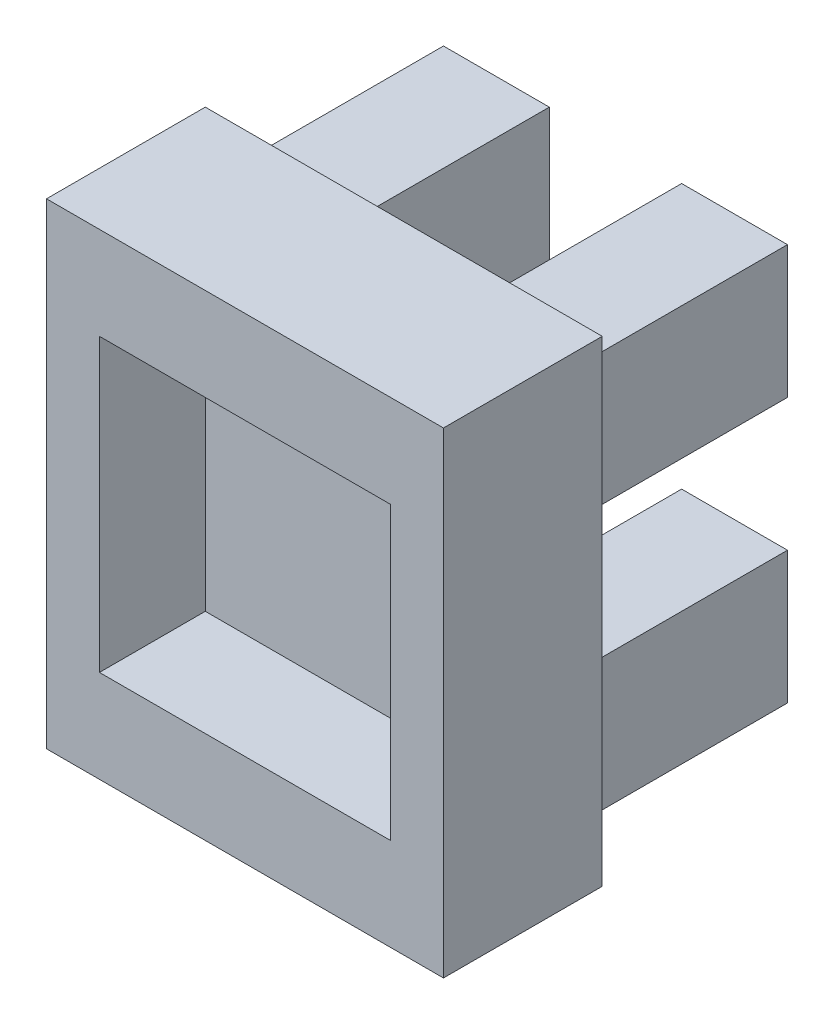
ISO-10303-21;
HEADER;
FILE_DESCRIPTION(('STEP AP214'),'2;1');
FILE_NAME('part.step','',(''),(''),'','','');
FILE_SCHEMA(('AUTOMOTIVE_DESIGN { 1 0 10303 214 1 1 1 1 }'));
ENDSEC;
DATA;
#1=APPLICATION_CONTEXT('core data for automotive mechanical design processes');
#2=APPLICATION_PROTOCOL_DEFINITION('international standard','automotive_design',2000,#1);
#3=PRODUCT_CONTEXT('',#1,'mechanical');
#4=PRODUCT('Part','Part','',(#3));
#5=PRODUCT_RELATED_PRODUCT_CATEGORY('part','',(#4));
#6=PRODUCT_DEFINITION_FORMATION('','',#4);
#7=PRODUCT_DEFINITION_CONTEXT('part definition',#1,'design');
#8=PRODUCT_DEFINITION('design','',#6,#7);
#9=PRODUCT_DEFINITION_SHAPE('','',#8);
#10=(LENGTH_UNIT() NAMED_UNIT(*) SI_UNIT(.MILLI.,.METRE.));
#11=(NAMED_UNIT(*) PLANE_ANGLE_UNIT() SI_UNIT($,.RADIAN.));
#12=(NAMED_UNIT(*) SI_UNIT($,.STERADIAN.) SOLID_ANGLE_UNIT());
#13=UNCERTAINTY_MEASURE_WITH_UNIT(LENGTH_MEASURE(1.E-05),#10,'distance_accuracy_value','');
#14=(GEOMETRIC_REPRESENTATION_CONTEXT(3) GLOBAL_UNCERTAINTY_ASSIGNED_CONTEXT((#13)) GLOBAL_UNIT_ASSIGNED_CONTEXT((#10,
#11,#12)) REPRESENTATION_CONTEXT('',''));
#15=CARTESIAN_POINT('',(0.,0.,0.));
#16=DIRECTION('',(0.,0.,1.));
#17=DIRECTION('',(1.,0.,0.));
#18=AXIS2_PLACEMENT_3D('',#15,#16,#17);
#19=CARTESIAN_POINT('',(7.5,-9.,3.));
#20=DIRECTION('',(-1.,0.,0.));
#21=DIRECTION('',(0.,0.,1.));
#22=AXIS2_PLACEMENT_3D('',#19,#20,#21);
#23=PLANE('',#22);
#24=DIRECTION('',(0.,1.,0.));
#25=VECTOR('',#24,1.);
#26=CARTESIAN_POINT('',(7.5,-9.,-3.));
#27=LINE('',#26,#25);
#28=CARTESIAN_POINT('',(7.5,-9.,-3.));
#29=VERTEX_POINT('',#28);
#30=CARTESIAN_POINT('',(7.5,9.,-3.));
#31=VERTEX_POINT('',#30);
#32=EDGE_CURVE('E361',#29,#31,#27,.T.);
#33=ORIENTED_EDGE('',*,*,#32,.T.);
#34=DIRECTION('',(0.,0.,-1.));
#35=VECTOR('',#34,1.);
#36=CARTESIAN_POINT('',(7.5,9.,3.));
#37=LINE('',#36,#35);
#38=CARTESIAN_POINT('',(7.5,9.,3.));
#39=VERTEX_POINT('',#38);
#40=EDGE_CURVE('E11',#39,#31,#37,.T.);
#41=ORIENTED_EDGE('',*,*,#40,.F.);
#42=DIRECTION('',(0.,1.,0.));
#43=VECTOR('',#42,1.);
#44=CARTESIAN_POINT('',(7.5,-9.,3.));
#45=LINE('',#44,#43);
#46=CARTESIAN_POINT('',(7.5,-9.,3.));
#47=VERTEX_POINT('',#46);
#48=EDGE_CURVE('E367',#47,#39,#45,.T.);
#49=ORIENTED_EDGE('',*,*,#48,.F.);
#50=DIRECTION('',(0.,0.,-1.));
#51=VECTOR('',#50,1.);
#52=CARTESIAN_POINT('',(7.5,-9.,3.));
#53=LINE('',#52,#51);
#54=EDGE_CURVE('E379',#47,#29,#53,.T.);
#55=ORIENTED_EDGE('',*,*,#54,.T.);
#56=EDGE_LOOP('',(#33,#41,#49,#55));
#57=FACE_BOUND('',#56,.T.);
#58=ADVANCED_FACE('F43',(#57),#23,.F.);
#59=CARTESIAN_POINT('',(-7.5,9.,3.));
#60=DIRECTION('',(0.,-1.,0.));
#61=DIRECTION('',(0.,0.,-1.));
#62=AXIS2_PLACEMENT_3D('',#59,#60,#61);
#63=PLANE('',#62);
#64=DIRECTION('',(-1.,0.,0.));
#65=VECTOR('',#64,1.);
#66=CARTESIAN_POINT('',(-7.5,9.,-3.));
#67=LINE('',#66,#65);
#68=CARTESIAN_POINT('',(-7.5,9.,-3.));
#69=VERTEX_POINT('',#68);
#70=EDGE_CURVE('E382',#31,#69,#67,.T.);
#71=ORIENTED_EDGE('',*,*,#70,.T.);
#72=DIRECTION('',(0.,0.,-1.));
#73=VECTOR('',#72,1.);
#74=CARTESIAN_POINT('',(-7.5,9.,3.));
#75=LINE('',#74,#73);
#76=CARTESIAN_POINT('',(-7.5,9.,3.));
#77=VERTEX_POINT('',#76);
#78=EDGE_CURVE('E49',#77,#69,#75,.T.);
#79=ORIENTED_EDGE('',*,*,#78,.F.);
#80=DIRECTION('',(-1.,0.,0.));
#81=VECTOR('',#80,1.);
#82=CARTESIAN_POINT('',(-7.5,9.,3.));
#83=LINE('',#82,#81);
#84=EDGE_CURVE('E373',#39,#77,#83,.T.);
#85=ORIENTED_EDGE('',*,*,#84,.F.);
#86=ORIENTED_EDGE('',*,*,#40,.T.);
#87=EDGE_LOOP('',(#71,#79,#85,#86));
#88=FACE_BOUND('',#87,.T.);
#89=ADVANCED_FACE('F411',(#88),#63,.F.);
#90=CARTESIAN_POINT('',(-7.5,-9.,3.));
#91=DIRECTION('',(1.,0.,0.));
#92=DIRECTION('',(0.,0.,-1.));
#93=AXIS2_PLACEMENT_3D('',#90,#91,#92);
#94=PLANE('',#93);
#95=DIRECTION('',(0.,-1.,0.));
#96=VECTOR('',#95,1.);
#97=CARTESIAN_POINT('',(-7.5,-9.,-3.));
#98=LINE('',#97,#96);
#99=CARTESIAN_POINT('',(-7.5,-9.,-3.));
#100=VERTEX_POINT('',#99);
#101=EDGE_CURVE('E384',#69,#100,#98,.T.);
#102=ORIENTED_EDGE('',*,*,#101,.T.);
#103=DIRECTION('',(0.,0.,-1.));
#104=VECTOR('',#103,1.);
#105=CARTESIAN_POINT('',(-7.5,-9.,3.));
#106=LINE('',#105,#104);
#107=CARTESIAN_POINT('',(-7.5,-9.,3.));
#108=VERTEX_POINT('',#107);
#109=EDGE_CURVE('E388',#108,#100,#106,.T.);
#110=ORIENTED_EDGE('',*,*,#109,.F.);
#111=DIRECTION('',(0.,-1.,0.));
#112=VECTOR('',#111,1.);
#113=CARTESIAN_POINT('',(-7.5,-9.,3.));
#114=LINE('',#113,#112);
#115=EDGE_CURVE('E376',#77,#108,#114,.T.);
#116=ORIENTED_EDGE('',*,*,#115,.F.);
#117=ORIENTED_EDGE('',*,*,#78,.T.);
#118=EDGE_LOOP('',(#102,#110,#116,#117));
#119=FACE_BOUND('',#118,.T.);
#120=ADVANCED_FACE('F396',(#119),#94,.F.);
#121=CARTESIAN_POINT('',(-7.5,-9.,3.));
#122=DIRECTION('',(0.,1.,0.));
#123=DIRECTION('',(-1.,0.,0.));
#124=AXIS2_PLACEMENT_3D('',#121,#122,#123);
#125=PLANE('',#124);
#126=DIRECTION('',(1.,0.,0.));
#127=VECTOR('',#126,1.);
#128=CARTESIAN_POINT('',(-7.5,-9.,-3.));
#129=LINE('',#128,#127);
#130=EDGE_CURVE('E372',#100,#29,#129,.T.);
#131=ORIENTED_EDGE('',*,*,#130,.T.);
#132=ORIENTED_EDGE('',*,*,#54,.F.);
#133=DIRECTION('',(1.,0.,0.));
#134=VECTOR('',#133,1.);
#135=CARTESIAN_POINT('',(-7.5,-9.,3.));
#136=LINE('',#135,#134);
#137=EDGE_CURVE('E378',#108,#47,#136,.T.);
#138=ORIENTED_EDGE('',*,*,#137,.F.);
#139=ORIENTED_EDGE('',*,*,#109,.T.);
#140=EDGE_LOOP('',(#131,#132,#138,#139));
#141=FACE_BOUND('',#140,.T.);
#142=ADVANCED_FACE('F403',(#141),#125,.F.);
#143=CARTESIAN_POINT('',(0.,0.,3.));
#144=DIRECTION('',(0.,0.,-1.));
#145=DIRECTION('',(-1.,0.,0.));
#146=AXIS2_PLACEMENT_3D('',#143,#144,#145);
#147=PLANE('',#146);
#148=DIRECTION('',(-1.,0.,0.));
#149=VECTOR('',#148,1.);
#150=CARTESIAN_POINT('',(-5.5,5.5,3.));
#151=LINE('',#150,#149);
#152=CARTESIAN_POINT('',(5.5,5.5,3.));
#153=VERTEX_POINT('',#152);
#154=CARTESIAN_POINT('',(-5.5,5.5,3.));
#155=VERTEX_POINT('',#154);
#156=EDGE_CURVE('E354',#153,#155,#151,.T.);
#157=ORIENTED_EDGE('',*,*,#156,.F.);
#158=DIRECTION('',(0.,1.,0.));
#159=VECTOR('',#158,1.);
#160=CARTESIAN_POINT('',(5.5,-5.5,3.));
#161=LINE('',#160,#159);
#162=CARTESIAN_POINT('',(5.5,-5.5,3.));
#163=VERTEX_POINT('',#162);
#164=EDGE_CURVE('E340',#163,#153,#161,.T.);
#165=ORIENTED_EDGE('',*,*,#164,.F.);
#166=DIRECTION('',(1.,0.,0.));
#167=VECTOR('',#166,1.);
#168=CARTESIAN_POINT('',(-5.5,-5.5,3.));
#169=LINE('',#168,#167);
#170=CARTESIAN_POINT('',(-5.5,-5.5,3.));
#171=VERTEX_POINT('',#170);
#172=EDGE_CURVE('E341',#171,#163,#169,.T.);
#173=ORIENTED_EDGE('',*,*,#172,.F.);
#174=DIRECTION('',(0.,-1.,0.));
#175=VECTOR('',#174,1.);
#176=CARTESIAN_POINT('',(-5.5,-5.5,3.));
#177=LINE('',#176,#175);
#178=EDGE_CURVE('E359',#155,#171,#177,.T.);
#179=ORIENTED_EDGE('',*,*,#178,.F.);
#180=EDGE_LOOP('',(#157,#165,#173,#179));
#181=FACE_BOUND('',#180,.T.);
#182=ORIENTED_EDGE('',*,*,#48,.T.);
#183=ORIENTED_EDGE('',*,*,#84,.T.);
#184=ORIENTED_EDGE('',*,*,#115,.T.);
#185=ORIENTED_EDGE('',*,*,#137,.T.);
#186=EDGE_LOOP('',(#182,#183,#184,#185));
#187=FACE_BOUND('',#186,.T.);
#188=ADVANCED_FACE('F414',(#181,#187),#147,.F.);
#189=CARTESIAN_POINT('',(0.,0.,-3.));
#190=DIRECTION('',(0.,0.,-1.));
#191=DIRECTION('',(-1.,0.,0.));
#192=AXIS2_PLACEMENT_3D('',#189,#190,#191);
#193=PLANE('',#192);
#194=DIRECTION('',(-1.,0.,0.));
#195=VECTOR('',#194,1.);
#196=CARTESIAN_POINT('',(6.5,-7.5,-3.));
#197=LINE('',#196,#195);
#198=CARTESIAN_POINT('',(6.5,-7.5,-3.));
#199=VERTEX_POINT('',#198);
#200=CARTESIAN_POINT('',(2.5,-7.5,-3.));
#201=VERTEX_POINT('',#200);
#202=EDGE_CURVE('E60',#199,#201,#197,.T.);
#203=ORIENTED_EDGE('',*,*,#202,.F.);
#204=DIRECTION('',(0.,-1.,0.));
#205=VECTOR('',#204,1.);
#206=CARTESIAN_POINT('',(6.5,-7.5,-3.));
#207=LINE('',#206,#205);
#208=CARTESIAN_POINT('',(6.5,-2.5,-3.));
#209=VERTEX_POINT('',#208);
#210=EDGE_CURVE('E62',#209,#199,#207,.T.);
#211=ORIENTED_EDGE('',*,*,#210,.F.);
#212=DIRECTION('',(1.,0.,0.));
#213=VECTOR('',#212,1.);
#214=CARTESIAN_POINT('',(6.5,-2.5,-3.));
#215=LINE('',#214,#213);
#216=CARTESIAN_POINT('',(2.5,-2.5,-3.));
#217=VERTEX_POINT('',#216);
#218=EDGE_CURVE('E292',#217,#209,#215,.T.);
#219=ORIENTED_EDGE('',*,*,#218,.F.);
#220=DIRECTION('',(0.,1.,0.));
#221=VECTOR('',#220,1.);
#222=CARTESIAN_POINT('',(2.5,-7.5,-3.));
#223=LINE('',#222,#221);
#224=EDGE_CURVE('E294',#201,#217,#223,.T.);
#225=ORIENTED_EDGE('',*,*,#224,.F.);
#226=EDGE_LOOP('',(#203,#211,#219,#225));
#227=FACE_BOUND('',#226,.T.);
#228=DIRECTION('',(0.,1.,0.));
#229=VECTOR('',#228,1.);
#230=CARTESIAN_POINT('',(-6.5,-7.5,-3.));
#231=LINE('',#230,#229);
#232=CARTESIAN_POINT('',(-6.5,-7.5,-3.));
#233=VERTEX_POINT('',#232);
#234=CARTESIAN_POINT('',(-6.5,-2.5,-3.));
#235=VERTEX_POINT('',#234);
#236=EDGE_CURVE('E226',#233,#235,#231,.T.);
#237=ORIENTED_EDGE('',*,*,#236,.F.);
#238=DIRECTION('',(-1.,0.,0.));
#239=VECTOR('',#238,1.);
#240=CARTESIAN_POINT('',(-6.5,-7.5,-3.));
#241=LINE('',#240,#239);
#242=CARTESIAN_POINT('',(-2.5,-7.5,-3.));
#243=VERTEX_POINT('',#242);
#244=EDGE_CURVE('E256',#243,#233,#241,.T.);
#245=ORIENTED_EDGE('',*,*,#244,.F.);
#246=DIRECTION('',(0.,-1.,0.));
#247=VECTOR('',#246,1.);
#248=CARTESIAN_POINT('',(-2.5,-7.5,-3.));
#249=LINE('',#248,#247);
#250=CARTESIAN_POINT('',(-2.5,-2.5,-3.));
#251=VERTEX_POINT('',#250);
#252=EDGE_CURVE('E261',#251,#243,#249,.T.);
#253=ORIENTED_EDGE('',*,*,#252,.F.);
#254=DIRECTION('',(1.,0.,0.));
#255=VECTOR('',#254,1.);
#256=CARTESIAN_POINT('',(-6.5,-2.5,-3.));
#257=LINE('',#256,#255);
#258=EDGE_CURVE('E264',#235,#251,#257,.T.);
#259=ORIENTED_EDGE('',*,*,#258,.F.);
#260=EDGE_LOOP('',(#237,#245,#253,#259));
#261=FACE_BOUND('',#260,.T.);
#262=DIRECTION('',(1.,0.,0.));
#263=VECTOR('',#262,1.);
#264=CARTESIAN_POINT('',(-6.5,7.5,-3.));
#265=LINE('',#264,#263);
#266=CARTESIAN_POINT('',(-6.5,7.5,-3.));
#267=VERTEX_POINT('',#266);
#268=CARTESIAN_POINT('',(-2.5,7.5,-3.));
#269=VERTEX_POINT('',#268);
#270=EDGE_CURVE('E222',#267,#269,#265,.T.);
#271=ORIENTED_EDGE('',*,*,#270,.F.);
#272=DIRECTION('',(0.,1.,0.));
#273=VECTOR('',#272,1.);
#274=CARTESIAN_POINT('',(-6.5,7.5,-3.));
#275=LINE('',#274,#273);
#276=CARTESIAN_POINT('',(-6.5,2.5,-3.));
#277=VERTEX_POINT('',#276);
#278=EDGE_CURVE('E210',#277,#267,#275,.T.);
#279=ORIENTED_EDGE('',*,*,#278,.F.);
#280=DIRECTION('',(-1.,0.,0.));
#281=VECTOR('',#280,1.);
#282=CARTESIAN_POINT('',(-6.5,2.5,-3.));
#283=LINE('',#282,#281);
#284=CARTESIAN_POINT('',(-2.5,2.5,-3.));
#285=VERTEX_POINT('',#284);
#286=EDGE_CURVE('E199',#285,#277,#283,.T.);
#287=ORIENTED_EDGE('',*,*,#286,.F.);
#288=DIRECTION('',(0.,-1.,0.));
#289=VECTOR('',#288,1.);
#290=CARTESIAN_POINT('',(-2.5,7.5,-3.));
#291=LINE('',#290,#289);
#292=EDGE_CURVE('E204',#269,#285,#291,.T.);
#293=ORIENTED_EDGE('',*,*,#292,.F.);
#294=EDGE_LOOP('',(#271,#279,#287,#293));
#295=FACE_BOUND('',#294,.T.);
#296=DIRECTION('',(0.,-1.,0.));
#297=VECTOR('',#296,1.);
#298=CARTESIAN_POINT('',(6.5,7.5,-3.));
#299=LINE('',#298,#297);
#300=CARTESIAN_POINT('',(6.5,7.5,-3.));
#301=VERTEX_POINT('',#300);
#302=CARTESIAN_POINT('',(6.5,2.5,-3.));
#303=VERTEX_POINT('',#302);
#304=EDGE_CURVE('E236',#301,#303,#299,.T.);
#305=ORIENTED_EDGE('',*,*,#304,.F.);
#306=DIRECTION('',(1.,0.,0.));
#307=VECTOR('',#306,1.);
#308=CARTESIAN_POINT('',(6.5,7.5,-3.));
#309=LINE('',#308,#307);
#310=CARTESIAN_POINT('',(2.5,7.5,-3.));
#311=VERTEX_POINT('',#310);
#312=EDGE_CURVE('E310',#311,#301,#309,.T.);
#313=ORIENTED_EDGE('',*,*,#312,.F.);
#314=DIRECTION('',(0.,1.,0.));
#315=VECTOR('',#314,1.);
#316=CARTESIAN_POINT('',(2.5,7.5,-3.));
#317=LINE('',#316,#315);
#318=CARTESIAN_POINT('',(2.5,2.5,-3.));
#319=VERTEX_POINT('',#318);
#320=EDGE_CURVE('E321',#319,#311,#317,.T.);
#321=ORIENTED_EDGE('',*,*,#320,.F.);
#322=DIRECTION('',(-1.,0.,0.));
#323=VECTOR('',#322,1.);
#324=CARTESIAN_POINT('',(6.5,2.5,-3.));
#325=LINE('',#324,#323);
#326=EDGE_CURVE('E318',#303,#319,#325,.T.);
#327=ORIENTED_EDGE('',*,*,#326,.F.);
#328=EDGE_LOOP('',(#305,#313,#321,#327));
#329=FACE_BOUND('',#328,.T.);
#330=ORIENTED_EDGE('',*,*,#32,.F.);
#331=ORIENTED_EDGE('',*,*,#130,.F.);
#332=ORIENTED_EDGE('',*,*,#101,.F.);
#333=ORIENTED_EDGE('',*,*,#70,.F.);
#334=EDGE_LOOP('',(#330,#331,#332,#333));
#335=FACE_BOUND('',#334,.T.);
#336=ADVANCED_FACE('F205',(#227,#261,#295,#329,#335),#193,.T.);
#337=CARTESIAN_POINT('',(5.5,-5.5,-1.));
#338=DIRECTION('',(1.,0.,0.));
#339=DIRECTION('',(0.,0.,-1.));
#340=AXIS2_PLACEMENT_3D('',#337,#338,#339);
#341=PLANE('',#340);
#342=ORIENTED_EDGE('',*,*,#164,.T.);
#343=DIRECTION('',(0.,0.,1.));
#344=VECTOR('',#343,1.);
#345=CARTESIAN_POINT('',(5.5,5.5,-1.));
#346=LINE('',#345,#344);
#347=CARTESIAN_POINT('',(5.5,5.5,-1.));
#348=VERTEX_POINT('',#347);
#349=EDGE_CURVE('E352',#348,#153,#346,.T.);
#350=ORIENTED_EDGE('',*,*,#349,.F.);
#351=DIRECTION('',(0.,1.,0.));
#352=VECTOR('',#351,1.);
#353=CARTESIAN_POINT('',(5.5,-5.5,-1.));
#354=LINE('',#353,#352);
#355=CARTESIAN_POINT('',(5.5,-5.5,-1.));
#356=VERTEX_POINT('',#355);
#357=EDGE_CURVE('E339',#356,#348,#354,.T.);
#358=ORIENTED_EDGE('',*,*,#357,.F.);
#359=DIRECTION('',(0.,0.,1.));
#360=VECTOR('',#359,1.);
#361=CARTESIAN_POINT('',(5.5,-5.5,-1.));
#362=LINE('',#361,#360);
#363=EDGE_CURVE('E363',#356,#163,#362,.T.);
#364=ORIENTED_EDGE('',*,*,#363,.T.);
#365=EDGE_LOOP('',(#342,#350,#358,#364));
#366=FACE_BOUND('',#365,.T.);
#367=ADVANCED_FACE('F424',(#366),#341,.F.);
#368=CARTESIAN_POINT('',(-5.5,-5.5,-1.));
#369=DIRECTION('',(0.,-1.,0.));
#370=DIRECTION('',(0.,0.,-1.));
#371=AXIS2_PLACEMENT_3D('',#368,#369,#370);
#372=PLANE('',#371);
#373=ORIENTED_EDGE('',*,*,#172,.T.);
#374=ORIENTED_EDGE('',*,*,#363,.F.);
#375=DIRECTION('',(1.,0.,0.));
#376=VECTOR('',#375,1.);
#377=CARTESIAN_POINT('',(-5.5,-5.5,-1.));
#378=LINE('',#377,#376);
#379=CARTESIAN_POINT('',(-5.5,-5.5,-1.));
#380=VERTEX_POINT('',#379);
#381=EDGE_CURVE('E346',#380,#356,#378,.T.);
#382=ORIENTED_EDGE('',*,*,#381,.F.);
#383=DIRECTION('',(0.,0.,1.));
#384=VECTOR('',#383,1.);
#385=CARTESIAN_POINT('',(-5.5,-5.5,-1.));
#386=LINE('',#385,#384);
#387=EDGE_CURVE('E365',#380,#171,#386,.T.);
#388=ORIENTED_EDGE('',*,*,#387,.T.);
#389=EDGE_LOOP('',(#373,#374,#382,#388));
#390=FACE_BOUND('',#389,.T.);
#391=ADVANCED_FACE('F429',(#390),#372,.F.);
#392=CARTESIAN_POINT('',(-5.5,-5.5,-1.));
#393=DIRECTION('',(-1.,0.,0.));
#394=DIRECTION('',(0.,0.,1.));
#395=AXIS2_PLACEMENT_3D('',#392,#393,#394);
#396=PLANE('',#395);
#397=ORIENTED_EDGE('',*,*,#178,.T.);
#398=ORIENTED_EDGE('',*,*,#387,.F.);
#399=DIRECTION('',(0.,-1.,0.));
#400=VECTOR('',#399,1.);
#401=CARTESIAN_POINT('',(-5.5,-5.5,-1.));
#402=LINE('',#401,#400);
#403=CARTESIAN_POINT('',(-5.5,5.5,-1.));
#404=VERTEX_POINT('',#403);
#405=EDGE_CURVE('E342',#404,#380,#402,.T.);
#406=ORIENTED_EDGE('',*,*,#405,.F.);
#407=DIRECTION('',(0.,0.,1.));
#408=VECTOR('',#407,1.);
#409=CARTESIAN_POINT('',(-5.5,5.5,-1.));
#410=LINE('',#409,#408);
#411=EDGE_CURVE('E368',#404,#155,#410,.T.);
#412=ORIENTED_EDGE('',*,*,#411,.T.);
#413=EDGE_LOOP('',(#397,#398,#406,#412));
#414=FACE_BOUND('',#413,.T.);
#415=ADVANCED_FACE('F436',(#414),#396,.F.);
#416=CARTESIAN_POINT('',(-5.5,5.5,-1.));
#417=DIRECTION('',(0.,1.,0.));
#418=DIRECTION('',(0.,0.,1.));
#419=AXIS2_PLACEMENT_3D('',#416,#417,#418);
#420=PLANE('',#419);
#421=ORIENTED_EDGE('',*,*,#156,.T.);
#422=ORIENTED_EDGE('',*,*,#411,.F.);
#423=DIRECTION('',(-1.,0.,0.));
#424=VECTOR('',#423,1.);
#425=CARTESIAN_POINT('',(-5.5,5.5,-1.));
#426=LINE('',#425,#424);
#427=EDGE_CURVE('E344',#348,#404,#426,.T.);
#428=ORIENTED_EDGE('',*,*,#427,.F.);
#429=ORIENTED_EDGE('',*,*,#349,.T.);
#430=EDGE_LOOP('',(#421,#422,#428,#429));
#431=FACE_BOUND('',#430,.T.);
#432=ADVANCED_FACE('F435',(#431),#420,.F.);
#433=CARTESIAN_POINT('',(0.,0.,-1.));
#434=DIRECTION('',(0.,0.,-1.));
#435=DIRECTION('',(-1.,0.,0.));
#436=AXIS2_PLACEMENT_3D('',#433,#434,#435);
#437=PLANE('',#436);
#438=ORIENTED_EDGE('',*,*,#357,.T.);
#439=ORIENTED_EDGE('',*,*,#427,.T.);
#440=ORIENTED_EDGE('',*,*,#405,.T.);
#441=ORIENTED_EDGE('',*,*,#381,.T.);
#442=EDGE_LOOP('',(#438,#439,#440,#441));
#443=FACE_BOUND('',#442,.T.);
#444=ADVANCED_FACE('F434',(#443),#437,.F.);
#445=CARTESIAN_POINT('',(6.5,7.5,-11.));
#446=DIRECTION('',(-1.,0.,0.));
#447=DIRECTION('',(0.,-1.,0.));
#448=AXIS2_PLACEMENT_3D('',#445,#446,#447);
#449=PLANE('',#448);
#450=ORIENTED_EDGE('',*,*,#304,.T.);
#451=DIRECTION('',(0.,0.,1.));
#452=VECTOR('',#451,1.);
#453=CARTESIAN_POINT('',(6.5,2.5,-11.));
#454=LINE('',#453,#452);
#455=CARTESIAN_POINT('',(6.5,2.5,-11.));
#456=VERTEX_POINT('',#455);
#457=EDGE_CURVE('E331',#456,#303,#454,.T.);
#458=ORIENTED_EDGE('',*,*,#457,.F.);
#459=DIRECTION('',(0.,-1.,0.));
#460=VECTOR('',#459,1.);
#461=CARTESIAN_POINT('',(6.5,7.5,-11.));
#462=LINE('',#461,#460);
#463=CARTESIAN_POINT('',(6.5,7.5,-11.));
#464=VERTEX_POINT('',#463);
#465=EDGE_CURVE('E302',#464,#456,#462,.T.);
#466=ORIENTED_EDGE('',*,*,#465,.F.);
#467=DIRECTION('',(0.,0.,1.));
#468=VECTOR('',#467,1.);
#469=CARTESIAN_POINT('',(6.5,7.5,-11.));
#470=LINE('',#469,#468);
#471=EDGE_CURVE('E312',#464,#301,#470,.T.);
#472=ORIENTED_EDGE('',*,*,#471,.T.);
#473=EDGE_LOOP('',(#450,#458,#466,#472));
#474=FACE_BOUND('',#473,.T.);
#475=ADVANCED_FACE('F447',(#474),#449,.F.);
#476=CARTESIAN_POINT('',(6.5,2.5,-11.));
#477=DIRECTION('',(0.,1.,0.));
#478=DIRECTION('',(0.,0.,1.));
#479=AXIS2_PLACEMENT_3D('',#476,#477,#478);
#480=PLANE('',#479);
#481=ORIENTED_EDGE('',*,*,#326,.T.);
#482=DIRECTION('',(0.,0.,1.));
#483=VECTOR('',#482,1.);
#484=CARTESIAN_POINT('',(2.5,2.5,-11.));
#485=LINE('',#484,#483);
#486=CARTESIAN_POINT('',(2.5,2.5,-11.));
#487=VERTEX_POINT('',#486);
#488=EDGE_CURVE('E332',#487,#319,#485,.T.);
#489=ORIENTED_EDGE('',*,*,#488,.F.);
#490=DIRECTION('',(-1.,0.,0.));
#491=VECTOR('',#490,1.);
#492=CARTESIAN_POINT('',(6.5,2.5,-11.));
#493=LINE('',#492,#491);
#494=EDGE_CURVE('E306',#456,#487,#493,.T.);
#495=ORIENTED_EDGE('',*,*,#494,.F.);
#496=ORIENTED_EDGE('',*,*,#457,.T.);
#497=EDGE_LOOP('',(#481,#489,#495,#496));
#498=FACE_BOUND('',#497,.T.);
#499=ADVANCED_FACE('F448',(#498),#480,.F.);
#500=CARTESIAN_POINT('',(2.5,7.5,-11.));
#501=DIRECTION('',(1.,0.,0.));
#502=DIRECTION('',(0.,1.,0.));
#503=AXIS2_PLACEMENT_3D('',#500,#501,#502);
#504=PLANE('',#503);
#505=ORIENTED_EDGE('',*,*,#320,.T.);
#506=DIRECTION('',(0.,0.,1.));
#507=VECTOR('',#506,1.);
#508=CARTESIAN_POINT('',(2.5,7.5,-11.));
#509=LINE('',#508,#507);
#510=CARTESIAN_POINT('',(2.5,7.5,-11.));
#511=VERTEX_POINT('',#510);
#512=EDGE_CURVE('E327',#511,#311,#509,.T.);
#513=ORIENTED_EDGE('',*,*,#512,.F.);
#514=DIRECTION('',(0.,1.,0.));
#515=VECTOR('',#514,1.);
#516=CARTESIAN_POINT('',(2.5,7.5,-11.));
#517=LINE('',#516,#515);
#518=EDGE_CURVE('E313',#487,#511,#517,.T.);
#519=ORIENTED_EDGE('',*,*,#518,.F.);
#520=ORIENTED_EDGE('',*,*,#488,.T.);
#521=EDGE_LOOP('',(#505,#513,#519,#520));
#522=FACE_BOUND('',#521,.T.);
#523=ADVANCED_FACE('F453',(#522),#504,.F.);
#524=CARTESIAN_POINT('',(6.5,7.5,-11.));
#525=DIRECTION('',(0.,-1.,0.));
#526=DIRECTION('',(1.,0.,0.));
#527=AXIS2_PLACEMENT_3D('',#524,#525,#526);
#528=PLANE('',#527);
#529=ORIENTED_EDGE('',*,*,#312,.T.);
#530=ORIENTED_EDGE('',*,*,#471,.F.);
#531=DIRECTION('',(1.,0.,0.));
#532=VECTOR('',#531,1.);
#533=CARTESIAN_POINT('',(6.5,7.5,-11.));
#534=LINE('',#533,#532);
#535=EDGE_CURVE('E311',#511,#464,#534,.T.);
#536=ORIENTED_EDGE('',*,*,#535,.F.);
#537=ORIENTED_EDGE('',*,*,#512,.T.);
#538=EDGE_LOOP('',(#529,#530,#536,#537));
#539=FACE_BOUND('',#538,.T.);
#540=ADVANCED_FACE('F456',(#539),#528,.F.);
#541=CARTESIAN_POINT('',(0.,0.,-11.));
#542=DIRECTION('',(0.,0.,-1.));
#543=DIRECTION('',(-1.,0.,0.));
#544=AXIS2_PLACEMENT_3D('',#541,#542,#543);
#545=PLANE('',#544);
#546=ORIENTED_EDGE('',*,*,#465,.T.);
#547=ORIENTED_EDGE('',*,*,#494,.T.);
#548=ORIENTED_EDGE('',*,*,#518,.T.);
#549=ORIENTED_EDGE('',*,*,#535,.T.);
#550=EDGE_LOOP('',(#546,#547,#548,#549));
#551=FACE_BOUND('',#550,.T.);
#552=ADVANCED_FACE('F465',(#551),#545,.T.);
#553=CARTESIAN_POINT('',(-6.5,7.5,-11.));
#554=DIRECTION('',(0.,-1.,0.));
#555=DIRECTION('',(1.,0.,0.));
#556=AXIS2_PLACEMENT_3D('',#553,#554,#555);
#557=PLANE('',#556);
#558=ORIENTED_EDGE('',*,*,#270,.T.);
#559=DIRECTION('',(0.,0.,1.));
#560=VECTOR('',#559,1.);
#561=CARTESIAN_POINT('',(-2.5,7.5,-11.));
#562=LINE('',#561,#560);
#563=CARTESIAN_POINT('',(-2.5,7.5,-11.));
#564=VERTEX_POINT('',#563);
#565=EDGE_CURVE('E218',#564,#269,#562,.T.);
#566=ORIENTED_EDGE('',*,*,#565,.F.);
#567=DIRECTION('',(1.,0.,0.));
#568=VECTOR('',#567,1.);
#569=CARTESIAN_POINT('',(-6.5,7.5,-11.));
#570=LINE('',#569,#568);
#571=CARTESIAN_POINT('',(-6.5,7.5,-11.));
#572=VERTEX_POINT('',#571);
#573=EDGE_CURVE('E232',#572,#564,#570,.T.);
#574=ORIENTED_EDGE('',*,*,#573,.F.);
#575=DIRECTION('',(0.,0.,1.));
#576=VECTOR('',#575,1.);
#577=CARTESIAN_POINT('',(-6.5,7.5,-11.));
#578=LINE('',#577,#576);
#579=EDGE_CURVE('E230',#572,#267,#578,.T.);
#580=ORIENTED_EDGE('',*,*,#579,.T.);
#581=EDGE_LOOP('',(#558,#566,#574,#580));
#582=FACE_BOUND('',#581,.T.);
#583=ADVANCED_FACE('F469',(#582),#557,.F.);
#584=CARTESIAN_POINT('',(-2.5,7.5,-11.));
#585=DIRECTION('',(-1.,0.,0.));
#586=DIRECTION('',(0.,-1.,0.));
#587=AXIS2_PLACEMENT_3D('',#584,#585,#586);
#588=PLANE('',#587);
#589=ORIENTED_EDGE('',*,*,#292,.T.);
#590=DIRECTION('',(0.,0.,1.));
#591=VECTOR('',#590,1.);
#592=CARTESIAN_POINT('',(-2.5,2.5,-11.));
#593=LINE('',#592,#591);
#594=CARTESIAN_POINT('',(-2.5,2.5,-11.));
#595=VERTEX_POINT('',#594);
#596=EDGE_CURVE('E216',#595,#285,#593,.T.);
#597=ORIENTED_EDGE('',*,*,#596,.F.);
#598=DIRECTION('',(0.,-1.,0.));
#599=VECTOR('',#598,1.);
#600=CARTESIAN_POINT('',(-2.5,7.5,-11.));
#601=LINE('',#600,#599);
#602=EDGE_CURVE('E242',#564,#595,#601,.T.);
#603=ORIENTED_EDGE('',*,*,#602,.F.);
#604=ORIENTED_EDGE('',*,*,#565,.T.);
#605=EDGE_LOOP('',(#589,#597,#603,#604));
#606=FACE_BOUND('',#605,.T.);
#607=ADVANCED_FACE('F214',(#606),#588,.F.);
#608=CARTESIAN_POINT('',(-6.5,2.5,-11.));
#609=DIRECTION('',(0.,1.,0.));
#610=DIRECTION('',(0.,0.,1.));
#611=AXIS2_PLACEMENT_3D('',#608,#609,#610);
#612=PLANE('',#611);
#613=ORIENTED_EDGE('',*,*,#286,.T.);
#614=DIRECTION('',(0.,0.,1.));
#615=VECTOR('',#614,1.);
#616=CARTESIAN_POINT('',(-6.5,2.5,-11.));
#617=LINE('',#616,#615);
#618=CARTESIAN_POINT('',(-6.5,2.5,-11.));
#619=VERTEX_POINT('',#618);
#620=EDGE_CURVE('E223',#619,#277,#617,.T.);
#621=ORIENTED_EDGE('',*,*,#620,.F.);
#622=DIRECTION('',(-1.,0.,0.));
#623=VECTOR('',#622,1.);
#624=CARTESIAN_POINT('',(-6.5,2.5,-11.));
#625=LINE('',#624,#623);
#626=EDGE_CURVE('E221',#595,#619,#625,.T.);
#627=ORIENTED_EDGE('',*,*,#626,.F.);
#628=ORIENTED_EDGE('',*,*,#596,.T.);
#629=EDGE_LOOP('',(#613,#621,#627,#628));
#630=FACE_BOUND('',#629,.T.);
#631=ADVANCED_FACE('F224',(#630),#612,.F.);
#632=CARTESIAN_POINT('',(-6.5,7.5,-11.));
#633=DIRECTION('',(1.,0.,0.));
#634=DIRECTION('',(0.,1.,0.));
#635=AXIS2_PLACEMENT_3D('',#632,#633,#634);
#636=PLANE('',#635);
#637=ORIENTED_EDGE('',*,*,#278,.T.);
#638=ORIENTED_EDGE('',*,*,#579,.F.);
#639=DIRECTION('',(0.,1.,0.));
#640=VECTOR('',#639,1.);
#641=CARTESIAN_POINT('',(-6.5,7.5,-11.));
#642=LINE('',#641,#640);
#643=EDGE_CURVE('E233',#619,#572,#642,.T.);
#644=ORIENTED_EDGE('',*,*,#643,.F.);
#645=ORIENTED_EDGE('',*,*,#620,.T.);
#646=EDGE_LOOP('',(#637,#638,#644,#645));
#647=FACE_BOUND('',#646,.T.);
#648=ADVANCED_FACE('F512',(#647),#636,.F.);
#649=CARTESIAN_POINT('',(0.,0.,-11.));
#650=DIRECTION('',(0.,0.,-1.));
#651=DIRECTION('',(-1.,0.,0.));
#652=AXIS2_PLACEMENT_3D('',#649,#650,#651);
#653=PLANE('',#652);
#654=ORIENTED_EDGE('',*,*,#573,.T.);
#655=ORIENTED_EDGE('',*,*,#602,.T.);
#656=ORIENTED_EDGE('',*,*,#626,.T.);
#657=ORIENTED_EDGE('',*,*,#643,.T.);
#658=EDGE_LOOP('',(#654,#655,#656,#657));
#659=FACE_BOUND('',#658,.T.);
#660=ADVANCED_FACE('F506',(#659),#653,.T.);
#661=CARTESIAN_POINT('',(-6.5,-7.5,-11.));
#662=DIRECTION('',(1.,0.,0.));
#663=DIRECTION('',(0.,1.,0.));
#664=AXIS2_PLACEMENT_3D('',#661,#662,#663);
#665=PLANE('',#664);
#666=ORIENTED_EDGE('',*,*,#236,.T.);
#667=DIRECTION('',(0.,0.,1.));
#668=VECTOR('',#667,1.);
#669=CARTESIAN_POINT('',(-6.5,-2.5,-11.));
#670=LINE('',#669,#668);
#671=CARTESIAN_POINT('',(-6.5,-2.5,-11.));
#672=VERTEX_POINT('',#671);
#673=EDGE_CURVE('E243',#672,#235,#670,.T.);
#674=ORIENTED_EDGE('',*,*,#673,.F.);
#675=DIRECTION('',(0.,1.,0.));
#676=VECTOR('',#675,1.);
#677=CARTESIAN_POINT('',(-6.5,-7.5,-11.));
#678=LINE('',#677,#676);
#679=CARTESIAN_POINT('',(-6.5,-7.5,-11.));
#680=VERTEX_POINT('',#679);
#681=EDGE_CURVE('E265',#680,#672,#678,.T.);
#682=ORIENTED_EDGE('',*,*,#681,.F.);
#683=DIRECTION('',(0.,0.,1.));
#684=VECTOR('',#683,1.);
#685=CARTESIAN_POINT('',(-6.5,-7.5,-11.));
#686=LINE('',#685,#684);
#687=EDGE_CURVE('E255',#680,#233,#686,.T.);
#688=ORIENTED_EDGE('',*,*,#687,.T.);
#689=EDGE_LOOP('',(#666,#674,#682,#688));
#690=FACE_BOUND('',#689,.T.);
#691=ADVANCED_FACE('F504',(#690),#665,.F.);
#692=CARTESIAN_POINT('',(-6.5,-2.5,-11.));
#693=DIRECTION('',(0.,-1.,0.));
#694=DIRECTION('',(0.,0.,-1.));
#695=AXIS2_PLACEMENT_3D('',#692,#693,#694);
#696=PLANE('',#695);
#697=ORIENTED_EDGE('',*,*,#258,.T.);
#698=DIRECTION('',(0.,0.,1.));
#699=VECTOR('',#698,1.);
#700=CARTESIAN_POINT('',(-2.5,-2.5,-11.));
#701=LINE('',#700,#699);
#702=CARTESIAN_POINT('',(-2.5,-2.5,-11.));
#703=VERTEX_POINT('',#702);
#704=EDGE_CURVE('E250',#703,#251,#701,.T.);
#705=ORIENTED_EDGE('',*,*,#704,.F.);
#706=DIRECTION('',(1.,0.,0.));
#707=VECTOR('',#706,1.);
#708=CARTESIAN_POINT('',(-6.5,-2.5,-11.));
#709=LINE('',#708,#707);
#710=EDGE_CURVE('E272',#672,#703,#709,.T.);
#711=ORIENTED_EDGE('',*,*,#710,.F.);
#712=ORIENTED_EDGE('',*,*,#673,.T.);
#713=EDGE_LOOP('',(#697,#705,#711,#712));
#714=FACE_BOUND('',#713,.T.);
#715=ADVANCED_FACE('F496',(#714),#696,.F.);
#716=CARTESIAN_POINT('',(-2.5,-7.5,-11.));
#717=DIRECTION('',(-1.,0.,0.));
#718=DIRECTION('',(0.,-1.,0.));
#719=AXIS2_PLACEMENT_3D('',#716,#717,#718);
#720=PLANE('',#719);
#721=ORIENTED_EDGE('',*,*,#252,.T.);
#722=DIRECTION('',(0.,0.,1.));
#723=VECTOR('',#722,1.);
#724=CARTESIAN_POINT('',(-2.5,-7.5,-11.));
#725=LINE('',#724,#723);
#726=CARTESIAN_POINT('',(-2.5,-7.5,-11.));
#727=VERTEX_POINT('',#726);
#728=EDGE_CURVE('E253',#727,#243,#725,.T.);
#729=ORIENTED_EDGE('',*,*,#728,.F.);
#730=DIRECTION('',(0.,-1.,0.));
#731=VECTOR('',#730,1.);
#732=CARTESIAN_POINT('',(-2.5,-7.5,-11.));
#733=LINE('',#732,#731);
#734=EDGE_CURVE('E271',#703,#727,#733,.T.);
#735=ORIENTED_EDGE('',*,*,#734,.F.);
#736=ORIENTED_EDGE('',*,*,#704,.T.);
#737=EDGE_LOOP('',(#721,#729,#735,#736));
#738=FACE_BOUND('',#737,.T.);
#739=ADVANCED_FACE('F494',(#738),#720,.F.);
#740=CARTESIAN_POINT('',(-6.5,-7.5,-11.));
#741=DIRECTION('',(0.,1.,0.));
#742=DIRECTION('',(-1.,0.,0.));
#743=AXIS2_PLACEMENT_3D('',#740,#741,#742);
#744=PLANE('',#743);
#745=ORIENTED_EDGE('',*,*,#244,.T.);
#746=ORIENTED_EDGE('',*,*,#687,.F.);
#747=DIRECTION('',(-1.,0.,0.));
#748=VECTOR('',#747,1.);
#749=CARTESIAN_POINT('',(-6.5,-7.5,-11.));
#750=LINE('',#749,#748);
#751=EDGE_CURVE('E260',#727,#680,#750,.T.);
#752=ORIENTED_EDGE('',*,*,#751,.F.);
#753=ORIENTED_EDGE('',*,*,#728,.T.);
#754=EDGE_LOOP('',(#745,#746,#752,#753));
#755=FACE_BOUND('',#754,.T.);
#756=ADVANCED_FACE('F491',(#755),#744,.F.);
#757=CARTESIAN_POINT('',(0.,0.,-11.));
#758=DIRECTION('',(0.,0.,-1.));
#759=DIRECTION('',(-1.,0.,0.));
#760=AXIS2_PLACEMENT_3D('',#757,#758,#759);
#761=PLANE('',#760);
#762=ORIENTED_EDGE('',*,*,#681,.T.);
#763=ORIENTED_EDGE('',*,*,#710,.T.);
#764=ORIENTED_EDGE('',*,*,#734,.T.);
#765=ORIENTED_EDGE('',*,*,#751,.T.);
#766=EDGE_LOOP('',(#762,#763,#764,#765));
#767=FACE_BOUND('',#766,.T.);
#768=ADVANCED_FACE('F490',(#767),#761,.T.);
#769=CARTESIAN_POINT('',(6.5,-7.5,-11.));
#770=DIRECTION('',(0.,1.,0.));
#771=DIRECTION('',(-1.,0.,0.));
#772=AXIS2_PLACEMENT_3D('',#769,#770,#771);
#773=PLANE('',#772);
#774=ORIENTED_EDGE('',*,*,#202,.T.);
#775=DIRECTION('',(0.,0.,1.));
#776=VECTOR('',#775,1.);
#777=CARTESIAN_POINT('',(2.5,-7.5,-11.));
#778=LINE('',#777,#776);
#779=CARTESIAN_POINT('',(2.5,-7.5,-11.));
#780=VERTEX_POINT('',#779);
#781=EDGE_CURVE('E280',#780,#201,#778,.T.);
#782=ORIENTED_EDGE('',*,*,#781,.F.);
#783=DIRECTION('',(-1.,0.,0.));
#784=VECTOR('',#783,1.);
#785=CARTESIAN_POINT('',(6.5,-7.5,-11.));
#786=LINE('',#785,#784);
#787=CARTESIAN_POINT('',(6.5,-7.5,-11.));
#788=VERTEX_POINT('',#787);
#789=EDGE_CURVE('E295',#788,#780,#786,.T.);
#790=ORIENTED_EDGE('',*,*,#789,.F.);
#791=DIRECTION('',(0.,0.,1.));
#792=VECTOR('',#791,1.);
#793=CARTESIAN_POINT('',(6.5,-7.5,-11.));
#794=LINE('',#793,#792);
#795=EDGE_CURVE('E289',#788,#199,#794,.T.);
#796=ORIENTED_EDGE('',*,*,#795,.T.);
#797=EDGE_LOOP('',(#774,#782,#790,#796));
#798=FACE_BOUND('',#797,.T.);
#799=ADVANCED_FACE('F483',(#798),#773,.F.);
#800=CARTESIAN_POINT('',(2.5,-7.5,-11.));
#801=DIRECTION('',(1.,0.,0.));
#802=DIRECTION('',(0.,1.,0.));
#803=AXIS2_PLACEMENT_3D('',#800,#801,#802);
#804=PLANE('',#803);
#805=ORIENTED_EDGE('',*,*,#224,.T.);
#806=DIRECTION('',(0.,0.,1.));
#807=VECTOR('',#806,1.);
#808=CARTESIAN_POINT('',(2.5,-2.5,-11.));
#809=LINE('',#808,#807);
#810=CARTESIAN_POINT('',(2.5,-2.5,-11.));
#811=VERTEX_POINT('',#810);
#812=EDGE_CURVE('E278',#811,#217,#809,.T.);
#813=ORIENTED_EDGE('',*,*,#812,.F.);
#814=DIRECTION('',(0.,1.,0.));
#815=VECTOR('',#814,1.);
#816=CARTESIAN_POINT('',(2.5,-7.5,-11.));
#817=LINE('',#816,#815);
#818=EDGE_CURVE('E304',#780,#811,#817,.T.);
#819=ORIENTED_EDGE('',*,*,#818,.F.);
#820=ORIENTED_EDGE('',*,*,#781,.T.);
#821=EDGE_LOOP('',(#805,#813,#819,#820));
#822=FACE_BOUND('',#821,.T.);
#823=ADVANCED_FACE('F479',(#822),#804,.F.);
#824=CARTESIAN_POINT('',(6.5,-2.5,-11.));
#825=DIRECTION('',(0.,-1.,0.));
#826=DIRECTION('',(0.,0.,-1.));
#827=AXIS2_PLACEMENT_3D('',#824,#825,#826);
#828=PLANE('',#827);
#829=ORIENTED_EDGE('',*,*,#218,.T.);
#830=DIRECTION('',(0.,0.,1.));
#831=VECTOR('',#830,1.);
#832=CARTESIAN_POINT('',(6.5,-2.5,-11.));
#833=LINE('',#832,#831);
#834=CARTESIAN_POINT('',(6.5,-2.5,-11.));
#835=VERTEX_POINT('',#834);
#836=EDGE_CURVE('E284',#835,#209,#833,.T.);
#837=ORIENTED_EDGE('',*,*,#836,.F.);
#838=DIRECTION('',(1.,0.,0.));
#839=VECTOR('',#838,1.);
#840=CARTESIAN_POINT('',(6.5,-2.5,-11.));
#841=LINE('',#840,#839);
#842=EDGE_CURVE('E296',#811,#835,#841,.T.);
#843=ORIENTED_EDGE('',*,*,#842,.F.);
#844=ORIENTED_EDGE('',*,*,#812,.T.);
#845=EDGE_LOOP('',(#829,#837,#843,#844));
#846=FACE_BOUND('',#845,.T.);
#847=ADVANCED_FACE('F474',(#846),#828,.F.);
#848=CARTESIAN_POINT('',(6.5,-7.5,-11.));
#849=DIRECTION('',(-1.,0.,0.));
#850=DIRECTION('',(0.,-1.,0.));
#851=AXIS2_PLACEMENT_3D('',#848,#849,#850);
#852=PLANE('',#851);
#853=ORIENTED_EDGE('',*,*,#210,.T.);
#854=ORIENTED_EDGE('',*,*,#795,.F.);
#855=DIRECTION('',(0.,-1.,0.));
#856=VECTOR('',#855,1.);
#857=CARTESIAN_POINT('',(6.5,-7.5,-11.));
#858=LINE('',#857,#856);
#859=EDGE_CURVE('E288',#835,#788,#858,.T.);
#860=ORIENTED_EDGE('',*,*,#859,.F.);
#861=ORIENTED_EDGE('',*,*,#836,.T.);
#862=EDGE_LOOP('',(#853,#854,#860,#861));
#863=FACE_BOUND('',#862,.T.);
#864=ADVANCED_FACE('F473',(#863),#852,.F.);
#865=CARTESIAN_POINT('',(0.,0.,-11.));
#866=DIRECTION('',(0.,0.,-1.));
#867=DIRECTION('',(-1.,0.,0.));
#868=AXIS2_PLACEMENT_3D('',#865,#866,#867);
#869=PLANE('',#868);
#870=ORIENTED_EDGE('',*,*,#789,.T.);
#871=ORIENTED_EDGE('',*,*,#818,.T.);
#872=ORIENTED_EDGE('',*,*,#842,.T.);
#873=ORIENTED_EDGE('',*,*,#859,.T.);
#874=EDGE_LOOP('',(#870,#871,#872,#873));
#875=FACE_BOUND('',#874,.T.);
#876=ADVANCED_FACE('F470',(#875),#869,.T.);
#877=CLOSED_SHELL('',(#58,#89,#120,#142,#188,#336,#367,#391,#415,#432,#444,#475,#499,#523,#540,
#552,#583,#607,#631,#648,#660,#691,#715,#739,#756,#768,#799,#823,#847,#864,#876));
#878=MANIFOLD_SOLID_BREP('B2',#877);
#879=ADVANCED_BREP_SHAPE_REPRESENTATION('',(#18,#878),#14);
#880=SHAPE_DEFINITION_REPRESENTATION(#9,#879);
ENDSEC;
END-ISO-10303-21;
